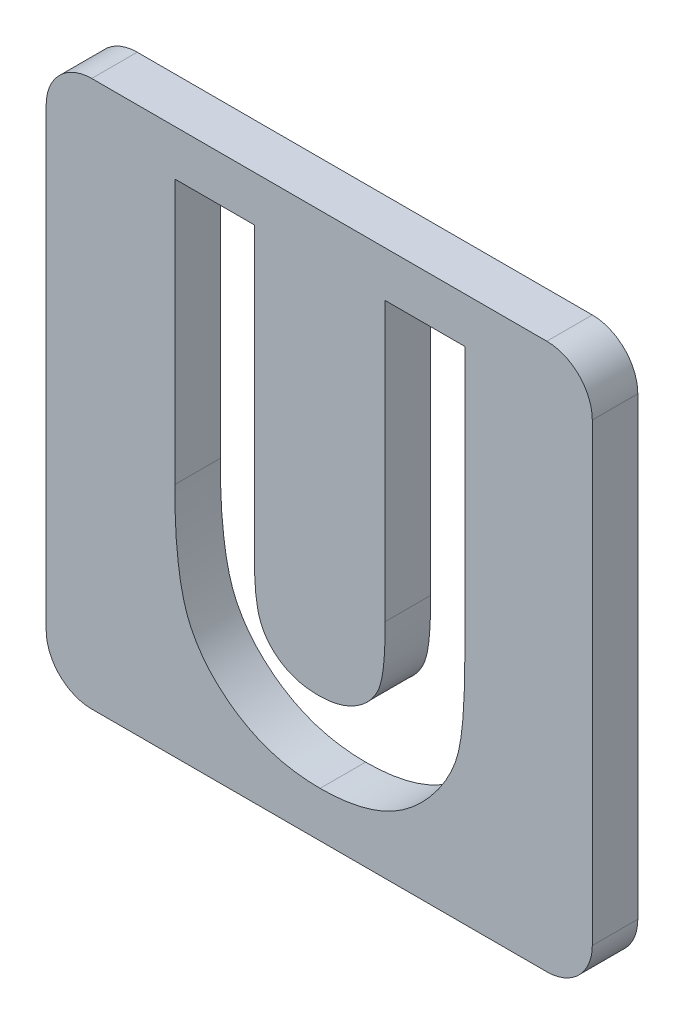
ISO-10303-21;
HEADER;
FILE_DESCRIPTION(('STEP AP214'),'2;1');
FILE_NAME('part.step','',(''),(''),'','','');
FILE_SCHEMA(('AUTOMOTIVE_DESIGN { 1 0 10303 214 1 1 1 1 }'));
ENDSEC;
DATA;
#1=APPLICATION_CONTEXT('core data for automotive mechanical design processes');
#2=APPLICATION_PROTOCOL_DEFINITION('international standard','automotive_design',2000,#1);
#3=PRODUCT_CONTEXT('',#1,'mechanical');
#4=PRODUCT('Part','Part','',(#3));
#5=PRODUCT_RELATED_PRODUCT_CATEGORY('part','',(#4));
#6=PRODUCT_DEFINITION_FORMATION('','',#4);
#7=PRODUCT_DEFINITION_CONTEXT('part definition',#1,'design');
#8=PRODUCT_DEFINITION('design','',#6,#7);
#9=PRODUCT_DEFINITION_SHAPE('','',#8);
#10=(LENGTH_UNIT() NAMED_UNIT(*) SI_UNIT(.MILLI.,.METRE.));
#11=(NAMED_UNIT(*) PLANE_ANGLE_UNIT() SI_UNIT($,.RADIAN.));
#12=(NAMED_UNIT(*) SI_UNIT($,.STERADIAN.) SOLID_ANGLE_UNIT());
#13=UNCERTAINTY_MEASURE_WITH_UNIT(LENGTH_MEASURE(1.E-05),#10,'distance_accuracy_value','');
#14=(GEOMETRIC_REPRESENTATION_CONTEXT(3) GLOBAL_UNCERTAINTY_ASSIGNED_CONTEXT((#13)) GLOBAL_UNIT_ASSIGNED_CONTEXT((#10,
#11,#12)) REPRESENTATION_CONTEXT('',''));
#15=CARTESIAN_POINT('',(0.,0.,0.));
#16=DIRECTION('',(0.,0.,1.));
#17=DIRECTION('',(1.,0.,0.));
#18=AXIS2_PLACEMENT_3D('',#15,#16,#17);
#19=CARTESIAN_POINT('',(50.,50.,10.));
#20=DIRECTION('',(0.,0.,-1.));
#21=DIRECTION('',(-1.,0.,0.));
#22=AXIS2_PLACEMENT_3D('',#19,#20,#21);
#23=PLANE('',#22);
#24=DIRECTION('',(1.,0.,0.));
#25=VECTOR('',#24,1.);
#26=CARTESIAN_POINT('',(-49.9999999999999,60.,10.));
#27=LINE('',#26,#25);
#28=CARTESIAN_POINT('',(-49.9999999999999,60.,10.));
#29=VERTEX_POINT('',#28);
#30=CARTESIAN_POINT('',(49.9999999999999,60.,10.));
#31=VERTEX_POINT('',#30);
#32=EDGE_CURVE('E279',#29,#31,#27,.T.);
#33=ORIENTED_EDGE('',*,*,#32,.F.);
#34=CARTESIAN_POINT('',(-50.,50.,10.));
#35=DIRECTION('',(0.,0.,1.));
#36=DIRECTION('',(1.,0.,0.));
#37=AXIS2_PLACEMENT_3D('',#34,#35,#36);
#38=CIRCLE('',#37,10.);
#39=CARTESIAN_POINT('',(-60.,49.9999999999999,10.));
#40=VERTEX_POINT('',#39);
#41=EDGE_CURVE('E266',#29,#40,#38,.T.);
#42=ORIENTED_EDGE('',*,*,#41,.T.);
#43=DIRECTION('',(0.,-1.,0.));
#44=VECTOR('',#43,1.);
#45=CARTESIAN_POINT('',(-60.,49.9999999999999,10.));
#46=LINE('',#45,#44);
#47=CARTESIAN_POINT('',(-60.,-49.9999999999999,10.));
#48=VERTEX_POINT('',#47);
#49=EDGE_CURVE('E294',#40,#48,#46,.T.);
#50=ORIENTED_EDGE('',*,*,#49,.T.);
#51=CARTESIAN_POINT('',(-50.,-50.,10.));
#52=DIRECTION('',(0.,0.,1.));
#53=DIRECTION('',(1.,0.,0.));
#54=AXIS2_PLACEMENT_3D('',#51,#52,#53);
#55=CIRCLE('',#54,10.);
#56=CARTESIAN_POINT('',(-49.9999999999999,-60.,10.));
#57=VERTEX_POINT('',#56);
#58=EDGE_CURVE('E298',#48,#57,#55,.T.);
#59=ORIENTED_EDGE('',*,*,#58,.T.);
#60=DIRECTION('',(1.,0.,0.));
#61=VECTOR('',#60,1.);
#62=CARTESIAN_POINT('',(-49.9999999999999,-60.,10.));
#63=LINE('',#62,#61);
#64=CARTESIAN_POINT('',(49.9999999999999,-60.,10.));
#65=VERTEX_POINT('',#64);
#66=EDGE_CURVE('E301',#57,#65,#63,.T.);
#67=ORIENTED_EDGE('',*,*,#66,.T.);
#68=CARTESIAN_POINT('',(50.,-50.,10.));
#69=DIRECTION('',(0.,0.,1.));
#70=DIRECTION('',(1.,0.,0.));
#71=AXIS2_PLACEMENT_3D('',#68,#69,#70);
#72=CIRCLE('',#71,10.);
#73=CARTESIAN_POINT('',(60.,-50.,10.));
#74=VERTEX_POINT('',#73);
#75=EDGE_CURVE('E305',#65,#74,#72,.T.);
#76=ORIENTED_EDGE('',*,*,#75,.T.);
#77=DIRECTION('',(0.,-1.,0.));
#78=VECTOR('',#77,1.);
#79=CARTESIAN_POINT('',(60.,49.9999999999999,10.));
#80=LINE('',#79,#78);
#81=CARTESIAN_POINT('',(60.,49.9999999999999,10.));
#82=VERTEX_POINT('',#81);
#83=EDGE_CURVE('E307',#82,#74,#80,.T.);
#84=ORIENTED_EDGE('',*,*,#83,.F.);
#85=CARTESIAN_POINT('',(50.,50.,10.));
#86=DIRECTION('',(0.,0.,-1.));
#87=DIRECTION('',(-1.,0.,0.));
#88=AXIS2_PLACEMENT_3D('',#85,#86,#87);
#89=CIRCLE('',#88,10.);
#90=EDGE_CURVE('E310',#31,#82,#89,.T.);
#91=ORIENTED_EDGE('',*,*,#90,.F.);
#92=EDGE_LOOP('',(#33,#42,#50,#59,#67,#76,#84,#91));
#93=FACE_BOUND('',#92,.T.);
#94=DIRECTION('',(0.,1.,0.));
#95=VECTOR('',#94,1.);
#96=CARTESIAN_POINT('',(-31.75,-8.1640625,10.));
#97=LINE('',#96,#95);
#98=CARTESIAN_POINT('',(-31.75,-8.1640625,10.));
#99=VERTEX_POINT('',#98);
#100=CARTESIAN_POINT('',(-31.75,50.,10.));
#101=VERTEX_POINT('',#100);
#102=EDGE_CURVE('E50',#99,#101,#97,.T.);
#103=ORIENTED_EDGE('',*,*,#102,.T.);
#104=DIRECTION('',(1.,0.,0.));
#105=VECTOR('',#104,1.);
#106=CARTESIAN_POINT('',(-31.75,50.,10.));
#107=LINE('',#106,#105);
#108=CARTESIAN_POINT('',(-14.25,50.,10.));
#109=VERTEX_POINT('',#108);
#110=EDGE_CURVE('E174',#101,#109,#107,.T.);
#111=ORIENTED_EDGE('',*,*,#110,.T.);
#112=DIRECTION('',(0.,-1.,0.));
#113=VECTOR('',#112,1.);
#114=CARTESIAN_POINT('',(-14.25,50.,10.));
#115=LINE('',#114,#113);
#116=CARTESIAN_POINT('',(-14.25,-13.4375,10.));
#117=VERTEX_POINT('',#116);
#118=EDGE_CURVE('E366',#109,#117,#115,.T.);
#119=ORIENTED_EDGE('',*,*,#118,.T.);
#120=CARTESIAN_POINT('',(-14.25,-13.4375,10.));
#121=CARTESIAN_POINT('',(-14.2490484363608,-14.0951924847793,10.));
#122=CARTESIAN_POINT('',(-14.2472105010214,-15.3655187251589,10.));
#123=CARTESIAN_POINT('',(-14.1552024953701,-17.1880209695564,10.));
#124=CARTESIAN_POINT('',(-14.0710088251384,-18.8632821239033,9.99999999999999));
#125=CARTESIAN_POINT('',(-13.9190995469349,-20.3894681352073,10.));
#126=CARTESIAN_POINT('',(-13.6946774754487,-21.7672318513229,10.));
#127=CARTESIAN_POINT('',(-13.4773636807233,-23.0054235368113,10.));
#128=CARTESIAN_POINT('',(-13.1832509487448,-24.0818747694511,10.));
#129=CARTESIAN_POINT('',(-12.7412465344111,-25.3071580940252,9.99999999999999));
#130=CARTESIAN_POINT('',(-12.0602628288159,-26.6838308347437,10.));
#131=CARTESIAN_POINT('',(-10.947573237891,-28.1186307477892,9.99999999999999));
#132=CARTESIAN_POINT('',(-9.66362463746305,-29.4280939212348,10.));
#133=CARTESIAN_POINT('',(-8.12473828869989,-30.5180414525487,10.));
#134=CARTESIAN_POINT('',(-6.39516612618332,-31.3997107650009,10.));
#135=CARTESIAN_POINT('',(-4.48441138079106,-32.0529301534458,10.));
#136=CARTESIAN_POINT('',(-2.39516753657686,-32.4160334015437,10.));
#137=CARTESIAN_POINT('',(-0.95057002357143,-32.4714677636762,10.));
#138=CARTESIAN_POINT('',(-0.207031249999996,-32.5,10.));
#139=B_SPLINE_CURVE_WITH_KNOTS('',3,(#120,#121,#122,#123,#124,#125,#126,#127,#128,#129,#130,
#131,#132,#133,#134,#135,#136,#137,#138),.UNSPECIFIED.,.F.,.F.,(4,1,1,1,1,1,1,1,1,1,1,1,1,1,1,1,
4),(0.,0.0722187479928819,0.139489765727669,0.200369997730342,0.256432725510009,
0.307803521550891,0.353658516531847,0.394419905646061,0.430155705944344,0.496666272508737,
0.562017617615052,0.628754548274603,0.697409640680356,0.768079194652633,0.841338126089807,
0.918336246547804,1.),.UNSPECIFIED.);
#140=CARTESIAN_POINT('',(-0.207031249999996,-32.5,10.));
#141=VERTEX_POINT('',#140);
#142=EDGE_CURVE('E358',#117,#141,#139,.T.);
#143=ORIENTED_EDGE('',*,*,#142,.T.);
#144=CARTESIAN_POINT('',(-0.207031249999996,-32.5,10.));
#145=CARTESIAN_POINT('',(0.582886939586227,-32.4769496158935,10.));
#146=CARTESIAN_POINT('',(2.12309367361762,-32.4320052693891,10.));
#147=CARTESIAN_POINT('',(4.33843586397027,-31.9908278544927,10.));
#148=CARTESIAN_POINT('',(6.39096296700672,-31.2883223169392,10.));
#149=CARTESIAN_POINT('',(8.23721598403741,-30.2856678789764,10.));
#150=CARTESIAN_POINT('',(9.8753575960698,-29.0838108136068,10.));
#151=CARTESIAN_POINT('',(11.2620101438744,-27.7133171342274,10.));
#152=CARTESIAN_POINT('',(12.3563512410763,-26.1714533883589,9.99999999999999));
#153=CARTESIAN_POINT('',(13.069602053978,-24.7489666693872,10.));
#154=CARTESIAN_POINT('',(13.4700572606676,-23.4396915180131,10.));
#155=CARTESIAN_POINT('',(13.7702183871685,-22.2699038526013,10.));
#156=CARTESIAN_POINT('',(13.9902696987655,-20.8896701995205,10.));
#157=CARTESIAN_POINT('',(14.1899074810833,-19.3205458845923,10.));
#158=CARTESIAN_POINT('',(14.3098744089698,-17.5462777997407,10.));
#159=CARTESIAN_POINT('',(14.4399589850227,-15.5811348402991,10.));
#160=CARTESIAN_POINT('',(14.4876361887483,-13.4116709712727,10.));
#161=CARTESIAN_POINT('',(14.4957624207717,-11.901032562537,10.));
#162=CARTESIAN_POINT('',(14.5,-11.11328125,10.));
#163=B_SPLINE_CURVE_WITH_KNOTS('',3,(#144,#145,#146,#147,#148,#149,#150,#151,#152,#153,#154,
#155,#156,#157,#158,#159,#160,#161,#162),.UNSPECIFIED.,.F.,.F.,(4,1,1,1,1,1,1,1,1,1,1,1,1,1,1,1,
4),(0.,0.0788326040104732,0.153710231209845,0.224677758665778,0.294808775191097,
0.362714786829459,0.427103243030982,0.488649765551411,0.550900246538702,0.585045833388331,
0.625272189534163,0.671465864431303,0.724549992884967,0.783264731722838,0.849073130859845,
0.921296295278386,1.),.UNSPECIFIED.);
#164=CARTESIAN_POINT('',(14.5,-11.11328125,10.));
#165=VERTEX_POINT('',#164);
#166=EDGE_CURVE('E353',#141,#165,#163,.T.);
#167=ORIENTED_EDGE('',*,*,#166,.T.);
#168=DIRECTION('',(0.,1.,0.));
#169=VECTOR('',#168,1.);
#170=CARTESIAN_POINT('',(14.5,-11.11328125,10.));
#171=LINE('',#170,#169);
#172=CARTESIAN_POINT('',(14.5,50.,10.));
#173=VERTEX_POINT('',#172);
#174=EDGE_CURVE('E350',#165,#173,#171,.T.);
#175=ORIENTED_EDGE('',*,*,#174,.T.);
#176=DIRECTION('',(1.,0.,0.));
#177=VECTOR('',#176,1.);
#178=CARTESIAN_POINT('',(14.5,50.,10.));
#179=LINE('',#178,#177);
#180=CARTESIAN_POINT('',(32.,50.,10.));
#181=VERTEX_POINT('',#180);
#182=EDGE_CURVE('E347',#173,#181,#179,.T.);
#183=ORIENTED_EDGE('',*,*,#182,.T.);
#184=DIRECTION('',(0.,-1.,0.));
#185=VECTOR('',#184,1.);
#186=CARTESIAN_POINT('',(32.,50.,10.));
#187=LINE('',#186,#185);
#188=CARTESIAN_POINT('',(32.,-8.1640625,10.));
#189=VERTEX_POINT('',#188);
#190=EDGE_CURVE('E341',#181,#189,#187,.T.);
#191=ORIENTED_EDGE('',*,*,#190,.T.);
#192=CARTESIAN_POINT('',(32.,-8.1640625,10.));
#193=CARTESIAN_POINT('',(31.9975698069181,-9.34246362584657,10.));
#194=CARTESIAN_POINT('',(31.9928967826272,-11.6084140667133,10.));
#195=CARTESIAN_POINT('',(31.9211332177197,-14.8647443104868,10.));
#196=CARTESIAN_POINT('',(31.7683615694763,-17.8388796486174,10.));
#197=CARTESIAN_POINT('',(31.6400510066597,-20.5316891170222,10.));
#198=CARTESIAN_POINT('',(31.3917261268805,-22.9395450561096,10.));
#199=CARTESIAN_POINT('',(31.1330298564636,-25.0727296975788,10.));
#200=CARTESIAN_POINT('',(30.8032992032255,-26.9236835183878,10.));
#201=CARTESIAN_POINT('',(30.3126798178803,-29.0307695039215,10.));
#202=CARTESIAN_POINT('',(29.4660160047966,-31.4570018497341,10.));
#203=CARTESIAN_POINT('',(28.1010829392264,-34.2507032184307,10.));
#204=CARTESIAN_POINT('',(26.3683887559396,-36.9859060815132,10.));
#205=CARTESIAN_POINT('',(24.320430823876,-39.632521321013,10.));
#206=CARTESIAN_POINT('',(22.0080989866587,-42.0911415859929,10.));
#207=CARTESIAN_POINT('',(19.4826625899724,-44.2494919390626,10.));
#208=CARTESIAN_POINT('',(16.7842445400178,-46.0752235952973,10.));
#209=CARTESIAN_POINT('',(13.8846483027027,-47.5236952153789,10.));
#210=CARTESIAN_POINT('',(10.7863415824758,-48.6533938831753,10.));
#211=CARTESIAN_POINT('',(7.45866894707229,-49.4124944883362,10.));
#212=CARTESIAN_POINT('',(3.90389960642384,-49.925352385462,10.));
#213=CARTESIAN_POINT('',(1.44855323376098,-49.9746186976034,10.));
#214=CARTESIAN_POINT('',(0.183593750000002,-50.,10.));
#215=B_SPLINE_CURVE_WITH_KNOTS('',3,(#192,#193,#194,#195,#196,#197,#198,#199,#200,#201,#202,
#203,#204,#205,#206,#207,#208,#209,#210,#211,#212,#213,#214),.UNSPECIFIED.,.F.,.F.,(4,1,1,1,1,1,
1,1,1,1,1,1,1,1,1,1,1,1,1,1,4),(0.,0.0585404168084433,0.112567512340349,0.161779878104781,
0.206487155582391,0.246457029948099,0.281999707406142,0.313212938236146,0.339806473518811,
0.389412612231683,0.440473479943506,0.493954739875606,0.549977876808832,0.606488083626716,
0.661318500098984,0.71469109895965,0.767918471329798,0.821938790058459,0.878107374070457,
0.937202655036045,1.),.UNSPECIFIED.);
#216=CARTESIAN_POINT('',(0.183593750000002,-50.,10.));
#217=VERTEX_POINT('',#216);
#218=EDGE_CURVE('E333',#189,#217,#215,.T.);
#219=ORIENTED_EDGE('',*,*,#218,.T.);
#220=CARTESIAN_POINT('',(0.183593750000002,-50.,10.));
#221=CARTESIAN_POINT('',(-0.656870495967965,-49.9858434897891,10.));
#222=CARTESIAN_POINT('',(-2.31508921175868,-49.9579129855534,10.));
#223=CARTESIAN_POINT('',(-4.75379073533711,-49.7116388957405,9.99999999999999));
#224=CARTESIAN_POINT('',(-7.11127481124813,-49.3487234902202,10.));
#225=CARTESIAN_POINT('',(-9.38311174435088,-48.8192672859413,9.99999999999999));
#226=CARTESIAN_POINT('',(-11.5771866558982,-48.1353087595451,10.));
#227=CARTESIAN_POINT('',(-13.6929166310021,-47.2934034457841,10.));
#228=CARTESIAN_POINT('',(-15.7224391071807,-46.2982473860247,10.));
#229=CARTESIAN_POINT('',(-17.6543971600191,-45.1589938626155,10.));
#230=CARTESIAN_POINT('',(-19.4864133507804,-43.9270872936537,10.));
#231=CARTESIAN_POINT('',(-21.1607815825217,-42.5614670050204,10.));
#232=CARTESIAN_POINT('',(-22.7351207963283,-41.1631257733375,10.));
#233=CARTESIAN_POINT('',(-24.1639489887658,-39.6732154641895,10.));
#234=CARTESIAN_POINT('',(-25.4579979323029,-38.107377594418,10.));
#235=CARTESIAN_POINT('',(-26.614602530502,-36.4620634629437,10.));
#236=CARTESIAN_POINT('',(-27.6320444555919,-34.7374192111626,10.));
#237=CARTESIAN_POINT('',(-28.5359168991873,-32.9023582314647,10.));
#238=CARTESIAN_POINT('',(-29.3095434932168,-30.8636109948088,10.));
#239=CARTESIAN_POINT('',(-29.9617397743938,-28.5486584251316,10.));
#240=CARTESIAN_POINT('',(-30.5315137936133,-25.9212159511732,10.));
#241=CARTESIAN_POINT('',(-30.9549362251411,-22.9753640852056,10.));
#242=CARTESIAN_POINT('',(-31.338813488437,-19.7208120267477,10.));
#243=CARTESIAN_POINT('',(-31.5817866306842,-16.1490811705301,10.));
#244=CARTESIAN_POINT('',(-31.7088968185791,-12.2600690411343,10.));
#245=CARTESIAN_POINT('',(-31.7359527386893,-9.56389755472658,10.));
#246=CARTESIAN_POINT('',(-31.75,-8.1640625,10.));
#247=B_SPLINE_CURVE_WITH_KNOTS('',3,(#220,#221,#222,#223,#224,#225,#226,#227,#228,#229,#230,
#231,#232,#233,#234,#235,#236,#237,#238,#239,#240,#241,#242,#243,#244,#245,#246),.UNSPECIFIED.,
.F.,.F.,(4,1,1,1,1,1,1,1,1,1,1,1,1,1,1,1,1,1,1,1,1,1,1,1,4),(0.,0.0417149324333616,
0.0823027059399525,0.121571814425737,0.160067124457446,0.197993762905224,0.235566171795278,
0.273004880533644,0.310090333109523,0.346846143253429,0.382483571833557,0.417271008289183,
0.451331619188808,0.484852741322246,0.518030851241919,0.551068545791126,0.584171000064779,
0.619466744441516,0.659157907251706,0.703471546957703,0.752840113921964,0.806844312420616,
0.866141938157023,0.930501747284921,1.),.UNSPECIFIED.);
#248=EDGE_CURVE('E168',#217,#99,#247,.T.);
#249=ORIENTED_EDGE('',*,*,#248,.T.);
#250=EDGE_LOOP('',(#103,#111,#119,#143,#167,#175,#183,#191,#219,#249));
#251=FACE_BOUND('',#250,.T.);
#252=ADVANCED_FACE('F33',(#93,#251),#23,.F.);
#253=CARTESIAN_POINT('',(50.,50.,0.));
#254=DIRECTION('',(0.,0.,-1.));
#255=DIRECTION('',(-1.,0.,0.));
#256=AXIS2_PLACEMENT_3D('',#253,#254,#255);
#257=PLANE('',#256);
#258=DIRECTION('',(1.,0.,0.));
#259=VECTOR('',#258,1.);
#260=CARTESIAN_POINT('',(-49.9999999999999,60.,0.));
#261=LINE('',#260,#259);
#262=CARTESIAN_POINT('',(-49.9999999999999,60.,0.));
#263=VERTEX_POINT('',#262);
#264=CARTESIAN_POINT('',(49.9999999999999,60.,0.));
#265=VERTEX_POINT('',#264);
#266=EDGE_CURVE('E175',#263,#265,#261,.T.);
#267=ORIENTED_EDGE('',*,*,#266,.T.);
#268=CARTESIAN_POINT('',(50.,50.,0.));
#269=DIRECTION('',(0.,0.,-1.));
#270=DIRECTION('',(-1.,0.,0.));
#271=AXIS2_PLACEMENT_3D('',#268,#269,#270);
#272=CIRCLE('',#271,10.);
#273=CARTESIAN_POINT('',(60.,49.9999999999999,0.));
#274=VERTEX_POINT('',#273);
#275=EDGE_CURVE('E250',#265,#274,#272,.T.);
#276=ORIENTED_EDGE('',*,*,#275,.T.);
#277=DIRECTION('',(0.,-1.,0.));
#278=VECTOR('',#277,1.);
#279=CARTESIAN_POINT('',(60.,49.9999999999999,0.));
#280=LINE('',#279,#278);
#281=CARTESIAN_POINT('',(60.,-50.,0.));
#282=VERTEX_POINT('',#281);
#283=EDGE_CURVE('E257',#274,#282,#280,.T.);
#284=ORIENTED_EDGE('',*,*,#283,.T.);
#285=CARTESIAN_POINT('',(50.,-50.,0.));
#286=DIRECTION('',(0.,0.,1.));
#287=DIRECTION('',(1.,0.,0.));
#288=AXIS2_PLACEMENT_3D('',#285,#286,#287);
#289=CIRCLE('',#288,10.);
#290=CARTESIAN_POINT('',(49.9999999999999,-60.,0.));
#291=VERTEX_POINT('',#290);
#292=EDGE_CURVE('E270',#291,#282,#289,.T.);
#293=ORIENTED_EDGE('',*,*,#292,.F.);
#294=DIRECTION('',(1.,0.,0.));
#295=VECTOR('',#294,1.);
#296=CARTESIAN_POINT('',(-49.9999999999999,-60.,0.));
#297=LINE('',#296,#295);
#298=CARTESIAN_POINT('',(-49.9999999999999,-60.,0.));
#299=VERTEX_POINT('',#298);
#300=EDGE_CURVE('E273',#299,#291,#297,.T.);
#301=ORIENTED_EDGE('',*,*,#300,.F.);
#302=CARTESIAN_POINT('',(-50.,-50.,0.));
#303=DIRECTION('',(0.,0.,1.));
#304=DIRECTION('',(1.,0.,0.));
#305=AXIS2_PLACEMENT_3D('',#302,#303,#304);
#306=CIRCLE('',#305,10.);
#307=CARTESIAN_POINT('',(-60.,-49.9999999999999,0.));
#308=VERTEX_POINT('',#307);
#309=EDGE_CURVE('E275',#308,#299,#306,.T.);
#310=ORIENTED_EDGE('',*,*,#309,.F.);
#311=DIRECTION('',(0.,-1.,0.));
#312=VECTOR('',#311,1.);
#313=CARTESIAN_POINT('',(-60.,49.9999999999999,0.));
#314=LINE('',#313,#312);
#315=CARTESIAN_POINT('',(-60.,49.9999999999999,0.));
#316=VERTEX_POINT('',#315);
#317=EDGE_CURVE('E277',#316,#308,#314,.T.);
#318=ORIENTED_EDGE('',*,*,#317,.F.);
#319=CARTESIAN_POINT('',(-50.,50.,0.));
#320=DIRECTION('',(0.,0.,1.));
#321=DIRECTION('',(1.,0.,0.));
#322=AXIS2_PLACEMENT_3D('',#319,#320,#321);
#323=CIRCLE('',#322,10.);
#324=EDGE_CURVE('E262',#263,#316,#323,.T.);
#325=ORIENTED_EDGE('',*,*,#324,.F.);
#326=EDGE_LOOP('',(#267,#276,#284,#293,#301,#310,#318,#325));
#327=FACE_BOUND('',#326,.T.);
#328=DIRECTION('',(1.,0.,0.));
#329=VECTOR('',#328,1.);
#330=CARTESIAN_POINT('',(-31.75,50.,0.));
#331=LINE('',#330,#329);
#332=CARTESIAN_POINT('',(-31.75,50.,0.));
#333=VERTEX_POINT('',#332);
#334=CARTESIAN_POINT('',(-14.25,50.,0.));
#335=VERTEX_POINT('',#334);
#336=EDGE_CURVE('E167',#333,#335,#331,.T.);
#337=ORIENTED_EDGE('',*,*,#336,.F.);
#338=DIRECTION('',(0.,1.,0.));
#339=VECTOR('',#338,1.);
#340=CARTESIAN_POINT('',(-31.75,-8.1640625,0.));
#341=LINE('',#340,#339);
#342=CARTESIAN_POINT('',(-31.75,-8.1640625,0.));
#343=VERTEX_POINT('',#342);
#344=EDGE_CURVE('E159',#343,#333,#341,.T.);
#345=ORIENTED_EDGE('',*,*,#344,.F.);
#346=CARTESIAN_POINT('',(0.183593750000002,-50.,0.));
#347=CARTESIAN_POINT('',(-0.656870495967965,-49.9858434897891,0.));
#348=CARTESIAN_POINT('',(-2.31508921175868,-49.9579129855534,0.));
#349=CARTESIAN_POINT('',(-4.75379073533711,-49.7116388957405,0.));
#350=CARTESIAN_POINT('',(-7.11127481124813,-49.3487234902202,0.));
#351=CARTESIAN_POINT('',(-9.38311174435088,-48.8192672859413,0.));
#352=CARTESIAN_POINT('',(-11.5771866558982,-48.1353087595451,0.));
#353=CARTESIAN_POINT('',(-13.6929166310021,-47.2934034457841,0.));
#354=CARTESIAN_POINT('',(-15.7224391071807,-46.2982473860247,0.));
#355=CARTESIAN_POINT('',(-17.6543971600191,-45.1589938626155,0.));
#356=CARTESIAN_POINT('',(-19.4864133507804,-43.9270872936537,0.));
#357=CARTESIAN_POINT('',(-21.1607815825217,-42.5614670050204,0.));
#358=CARTESIAN_POINT('',(-22.7351207963283,-41.1631257733375,0.));
#359=CARTESIAN_POINT('',(-24.1639489887658,-39.6732154641895,0.));
#360=CARTESIAN_POINT('',(-25.4579979323029,-38.107377594418,0.));
#361=CARTESIAN_POINT('',(-26.614602530502,-36.4620634629437,0.));
#362=CARTESIAN_POINT('',(-27.6320444555919,-34.7374192111626,0.));
#363=CARTESIAN_POINT('',(-28.5359168991873,-32.9023582314647,0.));
#364=CARTESIAN_POINT('',(-29.3095434932168,-30.8636109948088,0.));
#365=CARTESIAN_POINT('',(-29.9617397743938,-28.5486584251316,0.));
#366=CARTESIAN_POINT('',(-30.5315137936133,-25.9212159511732,0.));
#367=CARTESIAN_POINT('',(-30.9549362251411,-22.9753640852056,0.));
#368=CARTESIAN_POINT('',(-31.338813488437,-19.7208120267477,0.));
#369=CARTESIAN_POINT('',(-31.5817866306842,-16.1490811705301,0.));
#370=CARTESIAN_POINT('',(-31.7088968185791,-12.2600690411343,0.));
#371=CARTESIAN_POINT('',(-31.7359527386893,-9.56389755472658,0.));
#372=CARTESIAN_POINT('',(-31.75,-8.1640625,0.));
#373=B_SPLINE_CURVE_WITH_KNOTS('',3,(#346,#347,#348,#349,#350,#351,#352,#353,#354,#355,#356,
#357,#358,#359,#360,#361,#362,#363,#364,#365,#366,#367,#368,#369,#370,#371,#372),.UNSPECIFIED.,
.F.,.F.,(4,1,1,1,1,1,1,1,1,1,1,1,1,1,1,1,1,1,1,1,1,1,1,1,4),(0.,0.0417149324333616,
0.0823027059399525,0.121571814425737,0.160067124457446,0.197993762905224,0.235566171795278,
0.273004880533644,0.310090333109523,0.346846143253429,0.382483571833557,0.417271008289183,
0.451331619188808,0.484852741322246,0.518030851241919,0.551068545791126,0.584171000064779,
0.619466744441516,0.659157907251706,0.703471546957703,0.752840113921964,0.806844312420616,
0.866141938157023,0.930501747284921,1.),.UNSPECIFIED.);
#374=CARTESIAN_POINT('',(0.183593750000002,-50.,0.));
#375=VERTEX_POINT('',#374);
#376=EDGE_CURVE('E328',#375,#343,#373,.T.);
#377=ORIENTED_EDGE('',*,*,#376,.F.);
#378=CARTESIAN_POINT('',(32.,-8.1640625,0.));
#379=CARTESIAN_POINT('',(31.9975698069181,-9.34246362584657,0.));
#380=CARTESIAN_POINT('',(31.9928967826272,-11.6084140667133,0.));
#381=CARTESIAN_POINT('',(31.9211332177197,-14.8647443104868,0.));
#382=CARTESIAN_POINT('',(31.7683615694763,-17.8388796486174,0.));
#383=CARTESIAN_POINT('',(31.6400510066597,-20.5316891170222,0.));
#384=CARTESIAN_POINT('',(31.3917261268805,-22.9395450561096,0.));
#385=CARTESIAN_POINT('',(31.1330298564636,-25.0727296975788,0.));
#386=CARTESIAN_POINT('',(30.8032992032255,-26.9236835183878,0.));
#387=CARTESIAN_POINT('',(30.3126798178803,-29.0307695039215,0.));
#388=CARTESIAN_POINT('',(29.4660160047966,-31.4570018497341,0.));
#389=CARTESIAN_POINT('',(28.1010829392264,-34.2507032184307,0.));
#390=CARTESIAN_POINT('',(26.3683887559396,-36.9859060815132,0.));
#391=CARTESIAN_POINT('',(24.320430823876,-39.632521321013,0.));
#392=CARTESIAN_POINT('',(22.0080989866587,-42.0911415859929,0.));
#393=CARTESIAN_POINT('',(19.4826625899724,-44.2494919390626,0.));
#394=CARTESIAN_POINT('',(16.7842445400178,-46.0752235952973,0.));
#395=CARTESIAN_POINT('',(13.8846483027027,-47.5236952153789,0.));
#396=CARTESIAN_POINT('',(10.7863415824758,-48.6533938831753,0.));
#397=CARTESIAN_POINT('',(7.45866894707229,-49.4124944883362,0.));
#398=CARTESIAN_POINT('',(3.90389960642384,-49.925352385462,0.));
#399=CARTESIAN_POINT('',(1.44855323376098,-49.9746186976034,0.));
#400=CARTESIAN_POINT('',(0.183593750000002,-50.,0.));
#401=B_SPLINE_CURVE_WITH_KNOTS('',3,(#378,#379,#380,#381,#382,#383,#384,#385,#386,#387,#388,
#389,#390,#391,#392,#393,#394,#395,#396,#397,#398,#399,#400),.UNSPECIFIED.,.F.,.F.,(4,1,1,1,1,1,
1,1,1,1,1,1,1,1,1,1,1,1,1,1,4),(0.,0.0585404168084433,0.112567512340349,0.161779878104781,
0.206487155582391,0.246457029948099,0.281999707406142,0.313212938236146,0.339806473518811,
0.389412612231683,0.440473479943506,0.493954739875606,0.549977876808832,0.606488083626716,
0.661318500098984,0.71469109895965,0.767918471329798,0.821938790058459,0.878107374070457,
0.937202655036045,1.),.UNSPECIFIED.);
#402=CARTESIAN_POINT('',(32.,-8.1640625,0.));
#403=VERTEX_POINT('',#402);
#404=EDGE_CURVE('E378',#403,#375,#401,.T.);
#405=ORIENTED_EDGE('',*,*,#404,.F.);
#406=DIRECTION('',(0.,-1.,0.));
#407=VECTOR('',#406,1.);
#408=CARTESIAN_POINT('',(32.,50.,0.));
#409=LINE('',#408,#407);
#410=CARTESIAN_POINT('',(32.,50.,0.));
#411=VERTEX_POINT('',#410);
#412=EDGE_CURVE('E420',#411,#403,#409,.T.);
#413=ORIENTED_EDGE('',*,*,#412,.F.);
#414=DIRECTION('',(1.,0.,0.));
#415=VECTOR('',#414,1.);
#416=CARTESIAN_POINT('',(14.5,50.,0.));
#417=LINE('',#416,#415);
#418=CARTESIAN_POINT('',(14.5,50.,0.));
#419=VERTEX_POINT('',#418);
#420=EDGE_CURVE('E419',#419,#411,#417,.T.);
#421=ORIENTED_EDGE('',*,*,#420,.F.);
#422=DIRECTION('',(0.,1.,0.));
#423=VECTOR('',#422,1.);
#424=CARTESIAN_POINT('',(14.5,-11.11328125,0.));
#425=LINE('',#424,#423);
#426=CARTESIAN_POINT('',(14.5,-11.11328125,0.));
#427=VERTEX_POINT('',#426);
#428=EDGE_CURVE('E418',#427,#419,#425,.T.);
#429=ORIENTED_EDGE('',*,*,#428,.F.);
#430=CARTESIAN_POINT('',(-0.207031249999996,-32.5,0.));
#431=CARTESIAN_POINT('',(0.582886939586227,-32.4769496158935,0.));
#432=CARTESIAN_POINT('',(2.12309367361762,-32.4320052693891,0.));
#433=CARTESIAN_POINT('',(4.33843586397027,-31.9908278544927,0.));
#434=CARTESIAN_POINT('',(6.39096296700672,-31.2883223169392,0.));
#435=CARTESIAN_POINT('',(8.23721598403741,-30.2856678789764,0.));
#436=CARTESIAN_POINT('',(9.8753575960698,-29.0838108136068,0.));
#437=CARTESIAN_POINT('',(11.2620101438744,-27.7133171342274,0.));
#438=CARTESIAN_POINT('',(12.3563512410763,-26.1714533883589,0.));
#439=CARTESIAN_POINT('',(13.069602053978,-24.7489666693872,0.));
#440=CARTESIAN_POINT('',(13.4700572606676,-23.4396915180131,0.));
#441=CARTESIAN_POINT('',(13.7702183871685,-22.2699038526013,0.));
#442=CARTESIAN_POINT('',(13.9902696987655,-20.8896701995205,0.));
#443=CARTESIAN_POINT('',(14.1899074810833,-19.3205458845923,0.));
#444=CARTESIAN_POINT('',(14.3098744089698,-17.5462777997407,0.));
#445=CARTESIAN_POINT('',(14.4399589850227,-15.5811348402991,0.));
#446=CARTESIAN_POINT('',(14.4876361887483,-13.4116709712727,0.));
#447=CARTESIAN_POINT('',(14.4957624207717,-11.901032562537,0.));
#448=CARTESIAN_POINT('',(14.5,-11.11328125,0.));
#449=B_SPLINE_CURVE_WITH_KNOTS('',3,(#430,#431,#432,#433,#434,#435,#436,#437,#438,#439,#440,
#441,#442,#443,#444,#445,#446,#447,#448),.UNSPECIFIED.,.F.,.F.,(4,1,1,1,1,1,1,1,1,1,1,1,1,1,1,1,
4),(0.,0.0788326040104732,0.153710231209845,0.224677758665778,0.294808775191097,
0.362714786829459,0.427103243030982,0.488649765551411,0.550900246538702,0.585045833388331,
0.625272189534163,0.671465864431303,0.724549992884967,0.783264731722838,0.849073130859845,
0.921296295278386,1.),.UNSPECIFIED.);
#450=CARTESIAN_POINT('',(-0.207031249999996,-32.5,0.));
#451=VERTEX_POINT('',#450);
#452=EDGE_CURVE('E190',#451,#427,#449,.T.);
#453=ORIENTED_EDGE('',*,*,#452,.F.);
#454=CARTESIAN_POINT('',(-14.25,-13.4375,0.));
#455=CARTESIAN_POINT('',(-14.2490484363608,-14.0951924847793,0.));
#456=CARTESIAN_POINT('',(-14.2472105010214,-15.3655187251589,0.));
#457=CARTESIAN_POINT('',(-14.1552024953701,-17.1880209695564,0.));
#458=CARTESIAN_POINT('',(-14.0710088251384,-18.8632821239033,0.));
#459=CARTESIAN_POINT('',(-13.9190995469349,-20.3894681352073,0.));
#460=CARTESIAN_POINT('',(-13.6946774754487,-21.7672318513229,0.));
#461=CARTESIAN_POINT('',(-13.4773636807233,-23.0054235368113,0.));
#462=CARTESIAN_POINT('',(-13.1832509487448,-24.0818747694511,0.));
#463=CARTESIAN_POINT('',(-12.7412465344111,-25.3071580940252,0.));
#464=CARTESIAN_POINT('',(-12.0602628288159,-26.6838308347437,0.));
#465=CARTESIAN_POINT('',(-10.947573237891,-28.1186307477892,0.));
#466=CARTESIAN_POINT('',(-9.66362463746305,-29.4280939212348,0.));
#467=CARTESIAN_POINT('',(-8.12473828869989,-30.5180414525487,0.));
#468=CARTESIAN_POINT('',(-6.39516612618332,-31.3997107650009,0.));
#469=CARTESIAN_POINT('',(-4.48441138079106,-32.0529301534458,0.));
#470=CARTESIAN_POINT('',(-2.39516753657686,-32.4160334015437,0.));
#471=CARTESIAN_POINT('',(-0.95057002357143,-32.4714677636762,0.));
#472=CARTESIAN_POINT('',(-0.207031249999996,-32.5,0.));
#473=B_SPLINE_CURVE_WITH_KNOTS('',3,(#454,#455,#456,#457,#458,#459,#460,#461,#462,#463,#464,
#465,#466,#467,#468,#469,#470,#471,#472),.UNSPECIFIED.,.F.,.F.,(4,1,1,1,1,1,1,1,1,1,1,1,1,1,1,1,
4),(0.,0.0722187479928819,0.139489765727669,0.200369997730342,0.256432725510009,
0.307803521550891,0.353658516531847,0.394419905646061,0.430155705944344,0.496666272508737,
0.562017617615052,0.628754548274603,0.697409640680356,0.768079194652633,0.841338126089807,
0.918336246547804,1.),.UNSPECIFIED.);
#474=CARTESIAN_POINT('',(-14.25,-13.4375,0.));
#475=VERTEX_POINT('',#474);
#476=EDGE_CURVE('E183',#475,#451,#473,.T.);
#477=ORIENTED_EDGE('',*,*,#476,.F.);
#478=DIRECTION('',(0.,-1.,0.));
#479=VECTOR('',#478,1.);
#480=CARTESIAN_POINT('',(-14.25,50.,0.));
#481=LINE('',#480,#479);
#482=EDGE_CURVE('E181',#335,#475,#481,.T.);
#483=ORIENTED_EDGE('',*,*,#482,.F.);
#484=EDGE_LOOP('',(#337,#345,#377,#405,#413,#421,#429,#453,#477,#483));
#485=FACE_BOUND('',#484,.T.);
#486=ADVANCED_FACE('F179',(#327,#485),#257,.T.);
#487=CARTESIAN_POINT('',(-49.9999999999999,60.,10.));
#488=DIRECTION('',(0.,1.,0.));
#489=DIRECTION('',(0.,0.,1.));
#490=AXIS2_PLACEMENT_3D('',#487,#488,#489);
#491=PLANE('',#490);
#492=ORIENTED_EDGE('',*,*,#266,.F.);
#493=DIRECTION('',(0.,0.,-1.));
#494=VECTOR('',#493,1.);
#495=CARTESIAN_POINT('',(-49.9999999999999,60.,10.));
#496=LINE('',#495,#494);
#497=EDGE_CURVE('E11',#29,#263,#496,.T.);
#498=ORIENTED_EDGE('',*,*,#497,.F.);
#499=ORIENTED_EDGE('',*,*,#32,.T.);
#500=DIRECTION('',(0.,0.,-1.));
#501=VECTOR('',#500,1.);
#502=CARTESIAN_POINT('',(49.9999999999999,60.,10.));
#503=LINE('',#502,#501);
#504=EDGE_CURVE('E37',#31,#265,#503,.T.);
#505=ORIENTED_EDGE('',*,*,#504,.T.);
#506=EDGE_LOOP('',(#492,#498,#499,#505));
#507=FACE_BOUND('',#506,.T.);
#508=ADVANCED_FACE('F35',(#507),#491,.T.);
#509=CARTESIAN_POINT('',(-50.,50.,10.));
#510=DIRECTION('',(0.,0.,-1.));
#511=DIRECTION('',(-1.,0.,0.));
#512=AXIS2_PLACEMENT_3D('',#509,#510,#511);
#513=CYLINDRICAL_SURFACE('',#512,10.);
#514=ORIENTED_EDGE('',*,*,#324,.T.);
#515=DIRECTION('',(0.,0.,-1.));
#516=VECTOR('',#515,1.);
#517=CARTESIAN_POINT('',(-60.,49.9999999999999,10.));
#518=LINE('',#517,#516);
#519=EDGE_CURVE('E42',#40,#316,#518,.T.);
#520=ORIENTED_EDGE('',*,*,#519,.F.);
#521=ORIENTED_EDGE('',*,*,#41,.F.);
#522=ORIENTED_EDGE('',*,*,#497,.T.);
#523=EDGE_LOOP('',(#514,#520,#521,#522));
#524=FACE_BOUND('',#523,.T.);
#525=ADVANCED_FACE('F221',(#524),#513,.T.);
#526=CARTESIAN_POINT('',(-60.,49.9999999999999,10.));
#527=DIRECTION('',(1.,0.,0.));
#528=DIRECTION('',(0.,1.,0.));
#529=AXIS2_PLACEMENT_3D('',#526,#527,#528);
#530=PLANE('',#529);
#531=ORIENTED_EDGE('',*,*,#317,.T.);
#532=DIRECTION('',(0.,0.,-1.));
#533=VECTOR('',#532,1.);
#534=CARTESIAN_POINT('',(-60.,-49.9999999999999,10.));
#535=LINE('',#534,#533);
#536=EDGE_CURVE('E283',#48,#308,#535,.T.);
#537=ORIENTED_EDGE('',*,*,#536,.F.);
#538=ORIENTED_EDGE('',*,*,#49,.F.);
#539=ORIENTED_EDGE('',*,*,#519,.T.);
#540=EDGE_LOOP('',(#531,#537,#538,#539));
#541=FACE_BOUND('',#540,.T.);
#542=ADVANCED_FACE('F224',(#541),#530,.F.);
#543=CARTESIAN_POINT('',(-50.,-50.,10.));
#544=DIRECTION('',(0.,0.,-1.));
#545=DIRECTION('',(-1.,0.,0.));
#546=AXIS2_PLACEMENT_3D('',#543,#544,#545);
#547=CYLINDRICAL_SURFACE('',#546,10.);
#548=ORIENTED_EDGE('',*,*,#309,.T.);
#549=DIRECTION('',(0.,0.,-1.));
#550=VECTOR('',#549,1.);
#551=CARTESIAN_POINT('',(-49.9999999999999,-60.,10.));
#552=LINE('',#551,#550);
#553=EDGE_CURVE('E286',#57,#299,#552,.T.);
#554=ORIENTED_EDGE('',*,*,#553,.F.);
#555=ORIENTED_EDGE('',*,*,#58,.F.);
#556=ORIENTED_EDGE('',*,*,#536,.T.);
#557=EDGE_LOOP('',(#548,#554,#555,#556));
#558=FACE_BOUND('',#557,.T.);
#559=ADVANCED_FACE('F228',(#558),#547,.T.);
#560=CARTESIAN_POINT('',(-49.9999999999999,-60.,10.));
#561=DIRECTION('',(0.,1.,0.));
#562=DIRECTION('',(0.,0.,1.));
#563=AXIS2_PLACEMENT_3D('',#560,#561,#562);
#564=PLANE('',#563);
#565=ORIENTED_EDGE('',*,*,#300,.T.);
#566=DIRECTION('',(0.,0.,-1.));
#567=VECTOR('',#566,1.);
#568=CARTESIAN_POINT('',(49.9999999999999,-60.,10.));
#569=LINE('',#568,#567);
#570=EDGE_CURVE('E289',#65,#291,#569,.T.);
#571=ORIENTED_EDGE('',*,*,#570,.F.);
#572=ORIENTED_EDGE('',*,*,#66,.F.);
#573=ORIENTED_EDGE('',*,*,#553,.T.);
#574=EDGE_LOOP('',(#565,#571,#572,#573));
#575=FACE_BOUND('',#574,.T.);
#576=ADVANCED_FACE('F232',(#575),#564,.F.);
#577=CARTESIAN_POINT('',(50.,-50.,10.));
#578=DIRECTION('',(0.,0.,-1.));
#579=DIRECTION('',(-1.,0.,0.));
#580=AXIS2_PLACEMENT_3D('',#577,#578,#579);
#581=CYLINDRICAL_SURFACE('',#580,10.);
#582=ORIENTED_EDGE('',*,*,#292,.T.);
#583=DIRECTION('',(0.,0.,-1.));
#584=VECTOR('',#583,1.);
#585=CARTESIAN_POINT('',(60.,-50.,10.));
#586=LINE('',#585,#584);
#587=EDGE_CURVE('E292',#74,#282,#586,.T.);
#588=ORIENTED_EDGE('',*,*,#587,.F.);
#589=ORIENTED_EDGE('',*,*,#75,.F.);
#590=ORIENTED_EDGE('',*,*,#570,.T.);
#591=EDGE_LOOP('',(#582,#588,#589,#590));
#592=FACE_BOUND('',#591,.T.);
#593=ADVANCED_FACE('F236',(#592),#581,.T.);
#594=CARTESIAN_POINT('',(60.,49.9999999999999,10.));
#595=DIRECTION('',(1.,0.,0.));
#596=DIRECTION('',(0.,1.,0.));
#597=AXIS2_PLACEMENT_3D('',#594,#595,#596);
#598=PLANE('',#597);
#599=ORIENTED_EDGE('',*,*,#283,.F.);
#600=DIRECTION('',(0.,0.,-1.));
#601=VECTOR('',#600,1.);
#602=CARTESIAN_POINT('',(60.,49.9999999999999,10.));
#603=LINE('',#602,#601);
#604=EDGE_CURVE('E254',#82,#274,#603,.T.);
#605=ORIENTED_EDGE('',*,*,#604,.F.);
#606=ORIENTED_EDGE('',*,*,#83,.T.);
#607=ORIENTED_EDGE('',*,*,#587,.T.);
#608=EDGE_LOOP('',(#599,#605,#606,#607));
#609=FACE_BOUND('',#608,.T.);
#610=ADVANCED_FACE('F240',(#609),#598,.T.);
#611=CARTESIAN_POINT('',(50.,50.,10.));
#612=DIRECTION('',(0.,0.,-1.));
#613=DIRECTION('',(-1.,0.,0.));
#614=AXIS2_PLACEMENT_3D('',#611,#612,#613);
#615=CYLINDRICAL_SURFACE('',#614,10.);
#616=ORIENTED_EDGE('',*,*,#275,.F.);
#617=ORIENTED_EDGE('',*,*,#504,.F.);
#618=ORIENTED_EDGE('',*,*,#90,.T.);
#619=ORIENTED_EDGE('',*,*,#604,.T.);
#620=EDGE_LOOP('',(#616,#617,#618,#619));
#621=FACE_BOUND('',#620,.T.);
#622=ADVANCED_FACE('F214',(#621),#615,.T.);
#623=CARTESIAN_POINT('',(-31.75,-8.1640625,0.));
#624=DIRECTION('',(1.,0.,0.));
#625=DIRECTION('',(0.,0.,-1.));
#626=AXIS2_PLACEMENT_3D('',#623,#624,#625);
#627=PLANE('',#626);
#628=ORIENTED_EDGE('',*,*,#102,.F.);
#629=DIRECTION('',(0.,0.,1.));
#630=VECTOR('',#629,1.);
#631=CARTESIAN_POINT('',(-31.75,-8.1640625,0.));
#632=LINE('',#631,#630);
#633=EDGE_CURVE('E163',#343,#99,#632,.T.);
#634=ORIENTED_EDGE('',*,*,#633,.F.);
#635=ORIENTED_EDGE('',*,*,#344,.T.);
#636=DIRECTION('',(0.,0.,1.));
#637=VECTOR('',#636,1.);
#638=CARTESIAN_POINT('',(-31.75,50.,0.));
#639=LINE('',#638,#637);
#640=EDGE_CURVE('E162',#333,#101,#639,.T.);
#641=ORIENTED_EDGE('',*,*,#640,.T.);
#642=EDGE_LOOP('',(#628,#634,#635,#641));
#643=FACE_BOUND('',#642,.T.);
#644=ADVANCED_FACE('F161',(#643),#627,.T.);
#645=CARTESIAN_POINT('',(-31.75,50.,0.));
#646=DIRECTION('',(0.,-1.,0.));
#647=DIRECTION('',(0.,0.,-1.));
#648=AXIS2_PLACEMENT_3D('',#645,#646,#647);
#649=PLANE('',#648);
#650=ORIENTED_EDGE('',*,*,#110,.F.);
#651=ORIENTED_EDGE('',*,*,#640,.F.);
#652=ORIENTED_EDGE('',*,*,#336,.T.);
#653=DIRECTION('',(0.,0.,1.));
#654=VECTOR('',#653,1.);
#655=CARTESIAN_POINT('',(-14.25,50.,0.));
#656=LINE('',#655,#654);
#657=EDGE_CURVE('E176',#335,#109,#656,.T.);
#658=ORIENTED_EDGE('',*,*,#657,.T.);
#659=EDGE_LOOP('',(#650,#651,#652,#658));
#660=FACE_BOUND('',#659,.T.);
#661=ADVANCED_FACE('F171',(#660),#649,.T.);
#662=CARTESIAN_POINT('',(-14.25,50.,0.));
#663=DIRECTION('',(-1.,0.,0.));
#664=DIRECTION('',(0.,0.,1.));
#665=AXIS2_PLACEMENT_3D('',#662,#663,#664);
#666=PLANE('',#665);
#667=ORIENTED_EDGE('',*,*,#118,.F.);
#668=ORIENTED_EDGE('',*,*,#657,.F.);
#669=ORIENTED_EDGE('',*,*,#482,.T.);
#670=DIRECTION('',(0.,0.,1.));
#671=VECTOR('',#670,1.);
#672=CARTESIAN_POINT('',(-14.25,-13.4375,0.));
#673=LINE('',#672,#671);
#674=EDGE_CURVE('E314',#475,#117,#673,.T.);
#675=ORIENTED_EDGE('',*,*,#674,.T.);
#676=EDGE_LOOP('',(#667,#668,#669,#675));
#677=FACE_BOUND('',#676,.T.);
#678=ADVANCED_FACE('F204',(#677),#666,.T.);
#679=DIRECTION('',(0.,0.,1.));
#680=VECTOR('',#679,1.);
#681=SURFACE_OF_LINEAR_EXTRUSION('',#473,#680);
#682=ORIENTED_EDGE('',*,*,#142,.F.);
#683=ORIENTED_EDGE('',*,*,#674,.F.);
#684=ORIENTED_EDGE('',*,*,#476,.T.);
#685=DIRECTION('',(0.,0.,1.));
#686=VECTOR('',#685,1.);
#687=CARTESIAN_POINT('',(-0.207031249999996,-32.5,0.));
#688=LINE('',#687,#686);
#689=EDGE_CURVE('E316',#451,#141,#688,.T.);
#690=ORIENTED_EDGE('',*,*,#689,.T.);
#691=EDGE_LOOP('',(#682,#683,#684,#690));
#692=FACE_BOUND('',#691,.T.);
#693=ADVANCED_FACE('F199',(#692),#681,.T.);
#694=DIRECTION('',(0.,0.,1.));
#695=VECTOR('',#694,1.);
#696=SURFACE_OF_LINEAR_EXTRUSION('',#449,#695);
#697=ORIENTED_EDGE('',*,*,#166,.F.);
#698=ORIENTED_EDGE('',*,*,#689,.F.);
#699=ORIENTED_EDGE('',*,*,#452,.T.);
#700=DIRECTION('',(0.,0.,1.));
#701=VECTOR('',#700,1.);
#702=CARTESIAN_POINT('',(14.5,-11.11328125,0.));
#703=LINE('',#702,#701);
#704=EDGE_CURVE('E318',#427,#165,#703,.T.);
#705=ORIENTED_EDGE('',*,*,#704,.T.);
#706=EDGE_LOOP('',(#697,#698,#699,#705));
#707=FACE_BOUND('',#706,.T.);
#708=ADVANCED_FACE('F203',(#707),#696,.T.);
#709=CARTESIAN_POINT('',(14.5,-11.11328125,0.));
#710=DIRECTION('',(1.,0.,0.));
#711=DIRECTION('',(0.,0.,-1.));
#712=AXIS2_PLACEMENT_3D('',#709,#710,#711);
#713=PLANE('',#712);
#714=ORIENTED_EDGE('',*,*,#174,.F.);
#715=ORIENTED_EDGE('',*,*,#704,.F.);
#716=ORIENTED_EDGE('',*,*,#428,.T.);
#717=DIRECTION('',(0.,0.,1.));
#718=VECTOR('',#717,1.);
#719=CARTESIAN_POINT('',(14.5,50.,0.));
#720=LINE('',#719,#718);
#721=EDGE_CURVE('E320',#419,#173,#720,.T.);
#722=ORIENTED_EDGE('',*,*,#721,.T.);
#723=EDGE_LOOP('',(#714,#715,#716,#722));
#724=FACE_BOUND('',#723,.T.);
#725=ADVANCED_FACE('F400',(#724),#713,.T.);
#726=CARTESIAN_POINT('',(14.5,50.,0.));
#727=DIRECTION('',(0.,-1.,0.));
#728=DIRECTION('',(0.,0.,-1.));
#729=AXIS2_PLACEMENT_3D('',#726,#727,#728);
#730=PLANE('',#729);
#731=ORIENTED_EDGE('',*,*,#182,.F.);
#732=ORIENTED_EDGE('',*,*,#721,.F.);
#733=ORIENTED_EDGE('',*,*,#420,.T.);
#734=DIRECTION('',(0.,0.,1.));
#735=VECTOR('',#734,1.);
#736=CARTESIAN_POINT('',(32.,50.,0.));
#737=LINE('',#736,#735);
#738=EDGE_CURVE('E322',#411,#181,#737,.T.);
#739=ORIENTED_EDGE('',*,*,#738,.T.);
#740=EDGE_LOOP('',(#731,#732,#733,#739));
#741=FACE_BOUND('',#740,.T.);
#742=ADVANCED_FACE('F397',(#741),#730,.T.);
#743=CARTESIAN_POINT('',(32.,50.,0.));
#744=DIRECTION('',(-1.,0.,0.));
#745=DIRECTION('',(0.,0.,1.));
#746=AXIS2_PLACEMENT_3D('',#743,#744,#745);
#747=PLANE('',#746);
#748=ORIENTED_EDGE('',*,*,#190,.F.);
#749=ORIENTED_EDGE('',*,*,#738,.F.);
#750=ORIENTED_EDGE('',*,*,#412,.T.);
#751=DIRECTION('',(0.,0.,1.));
#752=VECTOR('',#751,1.);
#753=CARTESIAN_POINT('',(32.,-8.1640625,0.));
#754=LINE('',#753,#752);
#755=EDGE_CURVE('E324',#403,#189,#754,.T.);
#756=ORIENTED_EDGE('',*,*,#755,.T.);
#757=EDGE_LOOP('',(#748,#749,#750,#756));
#758=FACE_BOUND('',#757,.T.);
#759=ADVANCED_FACE('F393',(#758),#747,.T.);
#760=DIRECTION('',(0.,0.,1.));
#761=VECTOR('',#760,1.);
#762=SURFACE_OF_LINEAR_EXTRUSION('',#401,#761);
#763=ORIENTED_EDGE('',*,*,#218,.F.);
#764=ORIENTED_EDGE('',*,*,#755,.F.);
#765=ORIENTED_EDGE('',*,*,#404,.T.);
#766=DIRECTION('',(0.,0.,1.));
#767=VECTOR('',#766,1.);
#768=CARTESIAN_POINT('',(0.183593750000002,-50.,0.));
#769=LINE('',#768,#767);
#770=EDGE_CURVE('E58',#375,#217,#769,.T.);
#771=ORIENTED_EDGE('',*,*,#770,.T.);
#772=EDGE_LOOP('',(#763,#764,#765,#771));
#773=FACE_BOUND('',#772,.T.);
#774=ADVANCED_FACE('F390',(#773),#762,.T.);
#775=DIRECTION('',(0.,0.,1.));
#776=VECTOR('',#775,1.);
#777=SURFACE_OF_LINEAR_EXTRUSION('',#373,#776);
#778=ORIENTED_EDGE('',*,*,#248,.F.);
#779=ORIENTED_EDGE('',*,*,#770,.F.);
#780=ORIENTED_EDGE('',*,*,#376,.T.);
#781=ORIENTED_EDGE('',*,*,#633,.T.);
#782=EDGE_LOOP('',(#778,#779,#780,#781));
#783=FACE_BOUND('',#782,.T.);
#784=ADVANCED_FACE('F387',(#783),#777,.T.);
#785=CLOSED_SHELL('',(#252,#486,#508,#525,#542,#559,#576,#593,#610,#622,#644,#661,#678,#693,
#708,#725,#742,#759,#774,#784));
#786=MANIFOLD_SOLID_BREP('B2',#785);
#787=ADVANCED_BREP_SHAPE_REPRESENTATION('',(#18,#786),#14);
#788=SHAPE_DEFINITION_REPRESENTATION(#9,#787);
ENDSEC;
END-ISO-10303-21;
